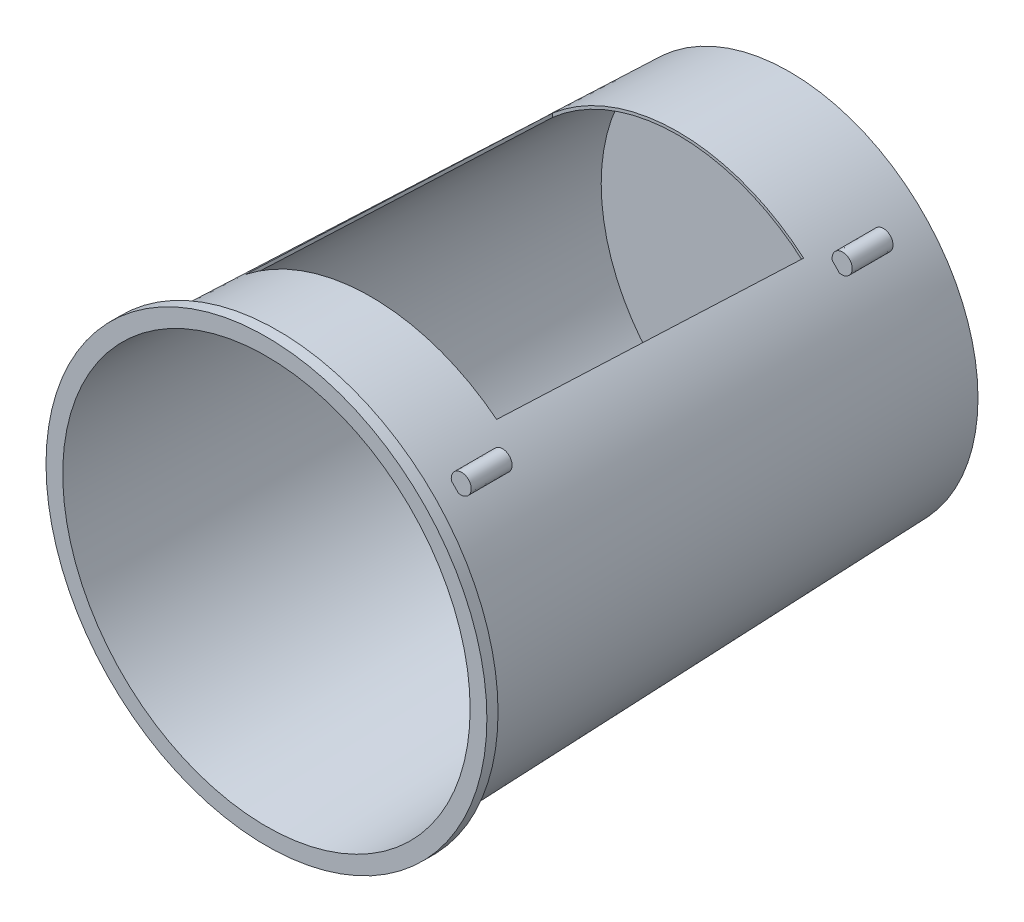
ISO-10303-21;
HEADER;
FILE_DESCRIPTION(('STEP AP214'),'2;1');
FILE_NAME('part.step','',(''),(''),'','','');
FILE_SCHEMA(('AUTOMOTIVE_DESIGN { 1 0 10303 214 1 1 1 1 }'));
ENDSEC;
DATA;
#1=APPLICATION_CONTEXT('core data for automotive mechanical design processes');
#2=APPLICATION_PROTOCOL_DEFINITION('international standard','automotive_design',2000,#1);
#3=PRODUCT_CONTEXT('',#1,'mechanical');
#4=PRODUCT('Part','Part','',(#3));
#5=PRODUCT_RELATED_PRODUCT_CATEGORY('part','',(#4));
#6=PRODUCT_DEFINITION_FORMATION('','',#4);
#7=PRODUCT_DEFINITION_CONTEXT('part definition',#1,'design');
#8=PRODUCT_DEFINITION('design','',#6,#7);
#9=PRODUCT_DEFINITION_SHAPE('','',#8);
#10=(LENGTH_UNIT() NAMED_UNIT(*) SI_UNIT(.MILLI.,.METRE.));
#11=(NAMED_UNIT(*) PLANE_ANGLE_UNIT() SI_UNIT($,.RADIAN.));
#12=(NAMED_UNIT(*) SI_UNIT($,.STERADIAN.) SOLID_ANGLE_UNIT());
#13=UNCERTAINTY_MEASURE_WITH_UNIT(LENGTH_MEASURE(1.E-05),#10,'distance_accuracy_value','');
#14=(GEOMETRIC_REPRESENTATION_CONTEXT(3) GLOBAL_UNCERTAINTY_ASSIGNED_CONTEXT((#13)) GLOBAL_UNIT_ASSIGNED_CONTEXT((#10,
#11,#12)) REPRESENTATION_CONTEXT('',''));
#15=CARTESIAN_POINT('',(0.,0.,0.));
#16=DIRECTION('',(0.,0.,1.));
#17=DIRECTION('',(1.,0.,0.));
#18=AXIS2_PLACEMENT_3D('',#15,#16,#17);
#19=CARTESIAN_POINT('',(0.,0.,-189.93070829077));
#20=DIRECTION('',(0.,0.,1.));
#21=DIRECTION('',(1.,0.,0.));
#22=AXIS2_PLACEMENT_3D('',#19,#20,#21);
#23=CONICAL_SURFACE('',#22,133.00120069566,0.0346527894684924);
#24=CARTESIAN_POINT('',(0.,0.,185.));
#25=DIRECTION('',(0.,0.,1.));
#26=DIRECTION('',(1.,0.,0.));
#27=AXIS2_PLACEMENT_3D('',#24,#25,#26);
#28=CIRCLE('',#27,145.998798585583);
#29=CARTESIAN_POINT('',(145.998798585583,0.,185.));
#30=VERTEX_POINT('',#29);
#31=EDGE_CURVE('E307',#30,#30,#28,.T.);
#32=ORIENTED_EDGE('',*,*,#31,.T.);
#33=EDGE_LOOP('',(#32));
#34=FACE_BOUND('',#33,.T.);
#35=CARTESIAN_POINT('',(0.,0.,-188.));
#36=DIRECTION('',(0.,0.,1.));
#37=DIRECTION('',(1.,0.,0.));
#38=AXIS2_PLACEMENT_3D('',#35,#36,#37);
#39=CIRCLE('',#38,133.068131916419);
#40=CARTESIAN_POINT('',(133.068131916419,0.,-188.));
#41=VERTEX_POINT('',#40);
#42=EDGE_CURVE('E301',#41,#41,#39,.T.);
#43=ORIENTED_EDGE('',*,*,#42,.F.);
#44=EDGE_LOOP('',(#43));
#45=FACE_BOUND('',#44,.T.);
#46=CARTESIAN_POINT('',(0.,0.,-110.));
#47=DIRECTION('',(0.,0.,-1.));
#48=DIRECTION('',(-1.,0.,0.));
#49=AXIS2_PLACEMENT_3D('',#46,#47,#48);
#50=CIRCLE('',#49,135.772131916941);
#51=CARTESIAN_POINT('',(-90.,101.656636798939,-110.));
#52=VERTEX_POINT('',#51);
#53=CARTESIAN_POINT('',(90.,101.656636798939,-110.));
#54=VERTEX_POINT('',#53);
#55=EDGE_CURVE('E295',#52,#54,#50,.T.);
#56=ORIENTED_EDGE('',*,*,#55,.F.);
#57=CARTESIAN_POINT('',(-90.,89.0636254051347,-374.037411749468));
#58=CARTESIAN_POINT('',(-90.,90.0676072974176,-353.665601403838));
#59=CARTESIAN_POINT('',(-90.,91.063099587906,-333.293374363985));
#60=CARTESIAN_POINT('',(-90.,93.0385628703297,-292.548170092011));
#61=CARTESIAN_POINT('',(-90.,94.0185338641786,-272.175192859983));
#62=CARTESIAN_POINT('',(-90.,96.9373487017259,-211.055324832955));
#63=CARTESIAN_POINT('',(-90.,98.8550979243955,-170.307426013567));
#64=CARTESIAN_POINT('',(-90.,102.699874120464,-87.5958899573949));
#65=CARTESIAN_POINT('',(-90.,104.62547651076,-45.6321866439225));
#66=CARTESIAN_POINT('',(-90.,108.434367562843,38.2971467555992));
#67=CARTESIAN_POINT('',(-90.,110.317656216751,80.2627768420058));
#68=CARTESIAN_POINT('',(-90.,113.115383651536,143.21250633273));
#69=CARTESIAN_POINT('',(-90.,114.043426901261,164.196002471134));
#70=CARTESIAN_POINT('',(-90.,115.891068987414,206.163366791269));
#71=CARTESIAN_POINT('',(-90.,116.810667823789,227.147234973003));
#72=CARTESIAN_POINT('',(-90.,118.6420067014,269.115304799135));
#73=CARTESIAN_POINT('',(-90.,119.553746746119,290.099506443382));
#74=CARTESIAN_POINT('',(-90.,121.369879932124,332.068227117523));
#75=CARTESIAN_POINT('',(-90.,122.274273073608,353.052746147409));
#76=CARTESIAN_POINT('',(-90.,123.175248527577,374.037411749468));
#77=B_SPLINE_CURVE_WITH_KNOTS('',3,(#57,#58,#59,#60,#61,#62,#63,#64,#65,#66,#67,#68,#69,#70,#71,
#72,#73,#74,#75,#76),.UNSPECIFIED.,.F.,.F.,(4,2,2,2,2,2,2,2,2,4),(0.,61.1896002512275,
122.379192958387,244.758163033068,370.781720741195,496.805301914434,559.817326210436,
622.829350895567,685.841347644155,748.853342683009),.UNSPECIFIED.);
#78=CARTESIAN_POINT('',(-90.,111.638772098427,110.));
#79=VERTEX_POINT('',#78);
#80=EDGE_CURVE('E245',#52,#79,#77,.T.);
#81=ORIENTED_EDGE('',*,*,#80,.T.);
#82=CARTESIAN_POINT('',(0.,0.,110.));
#83=DIRECTION('',(0.,0.,1.));
#84=DIRECTION('',(1.,0.,0.));
#85=AXIS2_PLACEMENT_3D('',#82,#83,#84);
#86=CIRCLE('',#85,143.398798585081);
#87=CARTESIAN_POINT('',(90.,111.638772098427,110.));
#88=VERTEX_POINT('',#87);
#89=EDGE_CURVE('E289',#88,#79,#86,.T.);
#90=ORIENTED_EDGE('',*,*,#89,.F.);
#91=CARTESIAN_POINT('',(90.,89.0636254051347,-374.037411749468));
#92=CARTESIAN_POINT('',(90.,90.0676072974176,-353.665601403838));
#93=CARTESIAN_POINT('',(90.,91.063099587906,-333.293374363985));
#94=CARTESIAN_POINT('',(90.,93.0385628703297,-292.548170092011));
#95=CARTESIAN_POINT('',(90.,94.0185338641786,-272.175192859983));
#96=CARTESIAN_POINT('',(90.,96.9373487017259,-211.055324832955));
#97=CARTESIAN_POINT('',(90.,98.8550979243955,-170.307426013567));
#98=CARTESIAN_POINT('',(90.,102.699874120464,-87.5958899573949));
#99=CARTESIAN_POINT('',(90.,104.62547651076,-45.6321866439225));
#100=CARTESIAN_POINT('',(90.,108.434367562843,38.2971467555992));
#101=CARTESIAN_POINT('',(90.,110.317656216751,80.2627768420058));
#102=CARTESIAN_POINT('',(90.,113.115383651536,143.21250633273));
#103=CARTESIAN_POINT('',(90.,114.043426901261,164.196002471134));
#104=CARTESIAN_POINT('',(90.,115.891068987414,206.163366791269));
#105=CARTESIAN_POINT('',(90.,116.810667823789,227.147234973003));
#106=CARTESIAN_POINT('',(90.,118.6420067014,269.115304799135));
#107=CARTESIAN_POINT('',(90.,119.553746746119,290.099506443382));
#108=CARTESIAN_POINT('',(90.,121.369879932124,332.068227117523));
#109=CARTESIAN_POINT('',(90.,122.274273073608,353.052746147409));
#110=CARTESIAN_POINT('',(90.,123.175248527577,374.037411749468));
#111=B_SPLINE_CURVE_WITH_KNOTS('',3,(#91,#92,#93,#94,#95,#96,#97,#98,#99,#100,#101,#102,#103,
#104,#105,#106,#107,#108,#109,#110),.UNSPECIFIED.,.F.,.F.,(4,2,2,2,2,2,2,2,2,4),(0.,
61.1896002512275,122.379192958387,244.758163033068,370.781720741195,496.805301914434,
559.817326210436,622.829350895567,685.841347644155,748.853342683009),.UNSPECIFIED.);
#112=EDGE_CURVE('E232',#54,#88,#111,.T.);
#113=ORIENTED_EDGE('',*,*,#112,.F.);
#114=EDGE_LOOP('',(#56,#81,#90,#113));
#115=FACE_BOUND('',#114,.T.);
#116=ADVANCED_FACE('F41',(#34,#45,#115),#23,.F.);
#117=CARTESIAN_POINT('',(0.,0.,-190.));
#118=DIRECTION('',(0.,0.,1.));
#119=DIRECTION('',(1.,0.,0.));
#120=AXIS2_PLACEMENT_3D('',#117,#118,#119);
#121=CONICAL_SURFACE('',#120,135.,0.0346527894684924);
#122=CARTESIAN_POINT('',(101.065715357302,92.877339283755,-124.789684729065));
#123=CARTESIAN_POINT('',(100.184733737483,93.8359132263013,-124.790990806455));
#124=CARTESIAN_POINT('',(99.290499636707,94.7815941603961,-124.791648497943));
#125=CARTESIAN_POINT('',(97.4755264732403,96.6471700116852,-124.791667109114));
#126=CARTESIAN_POINT('',(96.5547874105492,97.5670649288795,-124.791028028796));
#127=CARTESIAN_POINT('',(95.6207958669018,98.4740668376222,-124.789740562577));
#128=B_SPLINE_CURVE_WITH_KNOTS('',3,(#122,#123,#124,#125,#126,#127),.UNSPECIFIED.,.F.,.F.,(4,2,
4),(0.,3.90457518789542,7.80915037580249),.UNSPECIFIED.);
#129=CARTESIAN_POINT('',(100.850286553492,93.1112010640946,-124.789990673587));
#130=VERTEX_POINT('',#129);
#131=CARTESIAN_POINT('',(95.8084928532596,98.2914480446113,-124.789990673593));
#132=VERTEX_POINT('',#131);
#133=EDGE_CURVE('E173',#130,#132,#128,.T.);
#134=ORIENTED_EDGE('',*,*,#133,.T.);
#135=CARTESIAN_POINT('',(95.8854461942609,98.3657257226139,-121.706233881344));
#136=CARTESIAN_POINT('',(95.7686712306663,98.2530112187069,-126.385763032584));
#137=CARTESIAN_POINT('',(95.6518965391727,98.1402960729734,-131.065292175154));
#138=CARTESIAN_POINT('',(95.3475725358922,97.8465492071657,-143.260540474419));
#139=CARTESIAN_POINT('',(95.1600236538907,97.6655164733219,-150.776259617421));
#140=CARTESIAN_POINT('',(94.9724754737755,97.4844820838823,-158.29197873806));
#141=B_SPLINE_CURVE_WITH_KNOTS('',3,(#135,#136,#137,#138,#139,#140),.UNSPECIFIED.,.F.,.F.,(4,2,
4),(0.,14.0470283782484,36.6077427958624),.UNSPECIFIED.);
#142=CARTESIAN_POINT('',(95.0598653714643,97.568836652014,-154.789958379038));
#143=VERTEX_POINT('',#142);
#144=EDGE_CURVE('E11',#132,#143,#141,.T.);
#145=ORIENTED_EDGE('',*,*,#144,.T.);
#146=CARTESIAN_POINT('',(94.8732476883798,97.750320363789,-154.789707644403));
#147=CARTESIAN_POINT('',(95.8080979204527,96.8429120211217,-154.791006666208));
#148=CARTESIAN_POINT('',(96.7295761612279,95.9224944288822,-154.791651497327));
#149=CARTESIAN_POINT('',(98.5457886601796,94.0556407452615,-154.791632778193));
#150=CARTESIAN_POINT('',(99.4405229183563,93.1092046538804,-154.790969227939));
#151=CARTESIAN_POINT('',(100.321885185235,92.1497593129271,-154.789651486999));
#152=B_SPLINE_CURVE_WITH_KNOTS('',3,(#146,#147,#148,#149,#150,#151),.UNSPECIFIED.,.F.,.F.,(4,2,
4),(0.,3.90725222799838,7.81450445598476),.UNSPECIFIED.);
#153=CARTESIAN_POINT('',(100.107664272015,92.3824195616779,-154.789958379038));
#154=VERTEX_POINT('',#153);
#155=EDGE_CURVE('E54',#143,#154,#152,.T.);
#156=ORIENTED_EDGE('',*,*,#155,.T.);
#157=CARTESIAN_POINT('',(100.020973763606,92.2973463982562,-158.29197873806));
#158=CARTESIAN_POINT('',(100.136821732802,92.4110328199626,-153.612096160524));
#159=CARTESIAN_POINT('',(100.252669066878,92.5247195311705,-148.9322135743));
#160=CARTESIAN_POINT('',(100.554552549336,92.8209750826325,-136.736965302447));
#161=CARTESIAN_POINT('',(100.740587694943,93.0035443799733,-129.221599603099));
#162=CARTESIAN_POINT('',(100.926621202656,93.1861144239023,-121.706233881344));
#163=B_SPLINE_CURVE_WITH_KNOTS('',3,(#157,#158,#159,#160,#161,#162),.UNSPECIFIED.,.F.,.F.,(4,2,
4),(0.,14.0480894304417,36.6077427958624),.UNSPECIFIED.);
#164=EDGE_CURVE('E170',#154,#130,#163,.T.);
#165=ORIENTED_EDGE('',*,*,#164,.T.);
#166=EDGE_LOOP('',(#134,#145,#156,#165));
#167=FACE_BOUND('',#166,.T.);
#168=CARTESIAN_POINT('',(102.899803568351,105.082954785368,158.291941353487));
#169=CARTESIAN_POINT('',(102.783409639682,104.97065428562,153.628323271621));
#170=CARTESIAN_POINT('',(102.667015984789,104.858353213829,148.964705196696));
#171=CARTESIAN_POINT('',(102.362666672901,104.564703113654,136.770120450934));
#172=CARTESIAN_POINT('',(102.17471145605,104.383353165603,129.239153791257));
#173=CARTESIAN_POINT('',(101.986756953118,104.202001725841,121.708187149683));
#174=B_SPLINE_CURVE_WITH_KNOTS('',3,(#168,#169,#170,#171,#172,#173),.UNSPECIFIED.,.F.,.F.,(4,2,
4),(0.,13.9992654472103,36.6057482379346),.UNSPECIFIED.);
#175=CARTESIAN_POINT('',(102.822880774978,105.008737147525,155.209832861692));
#176=VERTEX_POINT('',#175);
#177=CARTESIAN_POINT('',(102.074150264432,104.286324652341,125.209862901135));
#178=VERTEX_POINT('',#177);
#179=EDGE_CURVE('E125',#176,#178,#174,.T.);
#180=ORIENTED_EDGE('',*,*,#179,.T.);
#181=CARTESIAN_POINT('',(101.870183038249,104.48558761549,125.210114926814));
#182=CARTESIAN_POINT('',(102.790389821351,103.588349351596,125.208934432825));
#183=CARTESIAN_POINT('',(103.698447781155,102.679291664296,125.208348652251));
#184=CARTESIAN_POINT('',(105.490266054169,100.837537442885,125.208366517931));
#185=CARTESIAN_POINT('',(106.374026367378,99.9048409087742,125.208970164186));
#186=CARTESIAN_POINT('',(107.24563785729,98.9603249512566,125.210168523855));
#187=B_SPLINE_CURVE_WITH_KNOTS('',3,(#181,#182,#183,#184,#185,#186),.UNSPECIFIED.,.F.,.F.,(4,2,
4),(0.,3.85468537277493,7.70937074554083),.UNSPECIFIED.);
#188=CARTESIAN_POINT('',(107.012664279194,99.2121935326898,125.209862901135));
#189=VERTEX_POINT('',#188);
#190=EDGE_CURVE('E127',#178,#189,#187,.T.);
#191=ORIENTED_EDGE('',*,*,#190,.T.);
#192=CARTESIAN_POINT('',(106.926005308352,99.1271160999092,121.708187149683));
#193=CARTESIAN_POINT('',(107.041428747923,99.2404328364401,126.372158647506));
#194=CARTESIAN_POINT('',(107.156851622408,99.3537498622092,131.036130152285));
#195=CARTESIAN_POINT('',(107.458638871193,99.6500333182738,143.230714875706));
#196=CARTESIAN_POINT('',(107.645002337373,99.8330002133886,150.761328105528));
#197=CARTESIAN_POINT('',(107.831364330347,100.015967862561,158.291941353487));
#198=B_SPLINE_CURVE_WITH_KNOTS('',3,(#192,#193,#194,#195,#196,#197),.UNSPECIFIED.,.F.,.F.,(4,2,
4),(0.,14.0003264415914,36.6057482379346),.UNSPECIFIED.);
#199=CARTESIAN_POINT('',(107.755090526673,99.9410834130379,155.209832861692));
#200=VERTEX_POINT('',#199);
#201=EDGE_CURVE('E112',#189,#200,#198,.T.);
#202=ORIENTED_EDGE('',*,*,#201,.T.);
#203=CARTESIAN_POINT('',(107.989371729131,99.6879049220844,155.210137680708));
#204=CARTESIAN_POINT('',(107.118189656349,100.631565071514,155.208949391695));
#205=CARTESIAN_POINT('',(106.234961910594,101.563506129267,155.208350804581));
#206=CARTESIAN_POINT('',(104.444415073141,103.403950061426,155.208333034149));
#207=CARTESIAN_POINT('',(103.537095981442,104.31245293583,155.208913850831));
#208=CARTESIAN_POINT('',(102.617731216771,105.209236718559,155.210084369411));
#209=B_SPLINE_CURVE_WITH_KNOTS('',3,(#203,#204,#205,#206,#207,#208),.UNSPECIFIED.,.F.,.F.,(4,2,
4),(0.,3.85194128962702,7.70388257926285),.UNSPECIFIED.);
#210=EDGE_CURVE('E109',#200,#176,#209,.T.);
#211=ORIENTED_EDGE('',*,*,#210,.T.);
#212=EDGE_LOOP('',(#180,#191,#202,#211));
#213=FACE_BOUND('',#212,.T.);
#214=CARTESIAN_POINT('',(0.,0.,177.));
#215=DIRECTION('',(0.,0.,1.));
#216=DIRECTION('',(1.,0.,0.));
#217=AXIS2_PLACEMENT_3D('',#214,#215,#216);
#218=CIRCLE('',#217,147.722666669123);
#219=CARTESIAN_POINT('',(147.722666669123,0.,177.));
#220=VERTEX_POINT('',#219);
#221=EDGE_CURVE('E268',#220,#220,#218,.T.);
#222=ORIENTED_EDGE('',*,*,#221,.F.);
#223=EDGE_LOOP('',(#222));
#224=FACE_BOUND('',#223,.T.);
#225=CARTESIAN_POINT('',(0.,0.,-190.));
#226=DIRECTION('',(0.,0.,1.));
#227=DIRECTION('',(1.,0.,0.));
#228=AXIS2_PLACEMENT_3D('',#225,#226,#227);
#229=CIRCLE('',#228,135.);
#230=CARTESIAN_POINT('',(135.,0.,-190.));
#231=VERTEX_POINT('',#230);
#232=EDGE_CURVE('E306',#231,#231,#229,.T.);
#233=ORIENTED_EDGE('',*,*,#232,.T.);
#234=EDGE_LOOP('',(#233));
#235=FACE_BOUND('',#234,.T.);
#236=CARTESIAN_POINT('',(-90.,91.8399681901596,-374.994513614155));
#237=CARTESIAN_POINT('',(-90.,92.8441407200379,-354.305319400002));
#238=CARTESIAN_POINT('',(-90.,93.8403230779255,-333.615738836066));
#239=CARTESIAN_POINT('',(-90.,95.8180455029985,-292.235879901309));
#240=CARTESIAN_POINT('',(-90.,96.7995855717161,-271.545601530562));
#241=CARTESIAN_POINT('',(-90.,99.7242467438915,-209.47388905803));
#242=CARTESIAN_POINT('',(-90.,101.647411887247,-168.09151409453));
#243=CARTESIAN_POINT('',(-90.,105.468323875797,-84.902998911837));
#244=CARTESIAN_POINT('',(-90.,107.365611990587,-43.0968376648368));
#245=CARTESIAN_POINT('',(-90.,111.121226418561,40.5172397240006));
#246=CARTESIAN_POINT('',(-90.,112.97955272575,82.3251558661068));
#247=CARTESIAN_POINT('',(-90.,116.662643992474,165.942597455484));
#248=CARTESIAN_POINT('',(-90.,118.487408846158,207.752122907414));
#249=CARTESIAN_POINT('',(-90.,121.202644539275,270.467350895956));
#250=CARTESIAN_POINT('',(-90.,122.10407101823,291.372579907486));
#251=CARTESIAN_POINT('',(-90.,123.900074837187,333.183331687077));
#252=CARTESIAN_POINT('',(-90.,124.794652177345,354.088854455131));
#253=CARTESIAN_POINT('',(-90.,125.686032275605,374.994513614155));
#254=B_SPLINE_CURVE_WITH_KNOTS('',3,(#236,#237,#238,#239,#240,#241,#242,#243,#244,#245,#246,
#247,#248,#249,#250,#251,#252,#253),.UNSPECIFIED.,.F.,.F.,(4,2,2,2,2,2,2,2,4),(0.,
62.1406436584152,124.281280814972,248.562364400903,374.10991834988,499.657491619445,
625.205460793101,687.979423641694,750.753385060985),.UNSPECIFIED.);
#255=CARTESIAN_POINT('',(-90.,104.314387204859,-110.));
#256=VERTEX_POINT('',#255);
#257=CARTESIAN_POINT('',(-90.,114.197898407037,110.));
#258=VERTEX_POINT('',#257);
#259=EDGE_CURVE('E116',#256,#258,#254,.T.);
#260=ORIENTED_EDGE('',*,*,#259,.F.);
#261=CARTESIAN_POINT('',(0.,0.,-110.));
#262=DIRECTION('',(0.,0.,-1.));
#263=DIRECTION('',(-1.,0.,0.));
#264=AXIS2_PLACEMENT_3D('',#261,#262,#263);
#265=CIRCLE('',#264,137.773333333869);
#266=CARTESIAN_POINT('',(90.,104.314387204859,-110.));
#267=VERTEX_POINT('',#266);
#268=EDGE_CURVE('E270',#256,#267,#265,.T.);
#269=ORIENTED_EDGE('',*,*,#268,.T.);
#270=CARTESIAN_POINT('',(90.,91.8399681901596,-374.994513614155));
#271=CARTESIAN_POINT('',(90.,92.8441407200379,-354.305319400002));
#272=CARTESIAN_POINT('',(90.,93.8403230779255,-333.615738836066));
#273=CARTESIAN_POINT('',(90.,95.8180455029985,-292.235879901309));
#274=CARTESIAN_POINT('',(90.,96.7995855717161,-271.545601530562));
#275=CARTESIAN_POINT('',(90.,99.7242467438915,-209.47388905803));
#276=CARTESIAN_POINT('',(90.,101.647411887247,-168.09151409453));
#277=CARTESIAN_POINT('',(90.,105.468323875797,-84.9029989118369));
#278=CARTESIAN_POINT('',(90.,107.365611990587,-43.0968376648368));
#279=CARTESIAN_POINT('',(90.,111.121226418561,40.5172397240006));
#280=CARTESIAN_POINT('',(90.,112.97955272575,82.3251558661068));
#281=CARTESIAN_POINT('',(90.,116.662643992474,165.942597455484));
#282=CARTESIAN_POINT('',(90.,118.487408846158,207.752122907414));
#283=CARTESIAN_POINT('',(90.,121.202644539275,270.467350895956));
#284=CARTESIAN_POINT('',(90.,122.10407101823,291.372579907486));
#285=CARTESIAN_POINT('',(90.,123.900074837187,333.183331687077));
#286=CARTESIAN_POINT('',(90.,124.794652177345,354.088854455131));
#287=CARTESIAN_POINT('',(90.,125.686032275605,374.994513614155));
#288=B_SPLINE_CURVE_WITH_KNOTS('',3,(#270,#271,#272,#273,#274,#275,#276,#277,#278,#279,#280,
#281,#282,#283,#284,#285,#286,#287),.UNSPECIFIED.,.F.,.F.,(4,2,2,2,2,2,2,2,4),(0.,
62.1406436584152,124.281280814972,248.562364400903,374.10991834988,499.657491619445,
625.205460793101,687.979423641694,750.753385060985),.UNSPECIFIED.);
#289=CARTESIAN_POINT('',(90.,114.197898407037,110.));
#290=VERTEX_POINT('',#289);
#291=EDGE_CURVE('E260',#267,#290,#288,.T.);
#292=ORIENTED_EDGE('',*,*,#291,.T.);
#293=CARTESIAN_POINT('',(0.,0.,110.));
#294=DIRECTION('',(0.,0.,1.));
#295=DIRECTION('',(1.,0.,0.));
#296=AXIS2_PLACEMENT_3D('',#293,#294,#295);
#297=CIRCLE('',#296,145.400000002008);
#298=EDGE_CURVE('E275',#290,#258,#297,.T.);
#299=ORIENTED_EDGE('',*,*,#298,.T.);
#300=EDGE_LOOP('',(#260,#269,#292,#299));
#301=FACE_BOUND('',#300,.T.);
#302=ADVANCED_FACE('F43',(#167,#213,#224,#235,#301),#121,.T.);
#303=CARTESIAN_POINT('',(0.,0.,185.));
#304=DIRECTION('',(0.,0.,1.));
#305=DIRECTION('',(1.,0.,0.));
#306=AXIS2_PLACEMENT_3D('',#303,#304,#305);
#307=PLANE('',#306);
#308=ORIENTED_EDGE('',*,*,#31,.F.);
#309=EDGE_LOOP('',(#308));
#310=FACE_BOUND('',#309,.T.);
#311=CARTESIAN_POINT('',(0.,0.,185.));
#312=DIRECTION('',(0.,0.,1.));
#313=DIRECTION('',(1.,0.,0.));
#314=AXIS2_PLACEMENT_3D('',#311,#312,#313);
#315=CIRCLE('',#314,158.);
#316=CARTESIAN_POINT('',(158.,0.,185.));
#317=VERTEX_POINT('',#316);
#318=EDGE_CURVE('E299',#317,#317,#315,.T.);
#319=ORIENTED_EDGE('',*,*,#318,.T.);
#320=EDGE_LOOP('',(#319));
#321=FACE_BOUND('',#320,.T.);
#322=ADVANCED_FACE('F319',(#310,#321),#307,.T.);
#323=CARTESIAN_POINT('',(0.,0.,-188.));
#324=DIRECTION('',(0.,0.,1.));
#325=DIRECTION('',(1.,0.,0.));
#326=AXIS2_PLACEMENT_3D('',#323,#324,#325);
#327=PLANE('',#326);
#328=ORIENTED_EDGE('',*,*,#42,.T.);
#329=EDGE_LOOP('',(#328));
#330=FACE_BOUND('',#329,.T.);
#331=ADVANCED_FACE('F322',(#330),#327,.T.);
#332=CARTESIAN_POINT('',(0.,0.,177.));
#333=DIRECTION('',(0.,0.,1.));
#334=DIRECTION('',(1.,0.,0.));
#335=AXIS2_PLACEMENT_3D('',#332,#333,#334);
#336=PLANE('',#335);
#337=ORIENTED_EDGE('',*,*,#221,.T.);
#338=EDGE_LOOP('',(#337));
#339=FACE_BOUND('',#338,.T.);
#340=CARTESIAN_POINT('',(0.,0.,177.));
#341=DIRECTION('',(0.,0.,1.));
#342=DIRECTION('',(1.,0.,0.));
#343=AXIS2_PLACEMENT_3D('',#340,#341,#342);
#344=CIRCLE('',#343,158.);
#345=CARTESIAN_POINT('',(158.,0.,177.));
#346=VERTEX_POINT('',#345);
#347=EDGE_CURVE('E293',#346,#346,#344,.T.);
#348=ORIENTED_EDGE('',*,*,#347,.F.);
#349=EDGE_LOOP('',(#348));
#350=FACE_BOUND('',#349,.T.);
#351=ADVANCED_FACE('F313',(#339,#350),#336,.F.);
#352=CARTESIAN_POINT('',(0.,0.,185.));
#353=DIRECTION('',(0.,0.,-1.));
#354=DIRECTION('',(-1.,0.,0.));
#355=AXIS2_PLACEMENT_3D('',#352,#353,#354);
#356=CYLINDRICAL_SURFACE('',#355,158.);
#357=ORIENTED_EDGE('',*,*,#318,.F.);
#358=EDGE_LOOP('',(#357));
#359=FACE_BOUND('',#358,.T.);
#360=ORIENTED_EDGE('',*,*,#347,.T.);
#361=EDGE_LOOP('',(#360));
#362=FACE_BOUND('',#361,.T.);
#363=ADVANCED_FACE('F337',(#359,#362),#356,.T.);
#364=CARTESIAN_POINT('',(0.,0.,-190.));
#365=DIRECTION('',(0.,0.,1.));
#366=DIRECTION('',(1.,0.,0.));
#367=AXIS2_PLACEMENT_3D('',#364,#365,#366);
#368=PLANE('',#367);
#369=ORIENTED_EDGE('',*,*,#232,.F.);
#370=EDGE_LOOP('',(#369));
#371=FACE_BOUND('',#370,.T.);
#372=ADVANCED_FACE('F345',(#371),#368,.F.);
#373=CARTESIAN_POINT('',(-90.,250.,110.));
#374=DIRECTION('',(0.,0.,1.));
#375=DIRECTION('',(1.,0.,0.));
#376=AXIS2_PLACEMENT_3D('',#373,#374,#375);
#377=PLANE('',#376);
#378=ORIENTED_EDGE('',*,*,#89,.T.);
#379=DIRECTION('',(0.,-1.,0.));
#380=VECTOR('',#379,1.);
#381=CARTESIAN_POINT('',(-90.,250.,110.));
#382=LINE('',#381,#380);
#383=EDGE_CURVE('E223',#258,#79,#382,.T.);
#384=ORIENTED_EDGE('',*,*,#383,.F.);
#385=ORIENTED_EDGE('',*,*,#298,.F.);
#386=DIRECTION('',(0.,-1.,0.));
#387=VECTOR('',#386,1.);
#388=CARTESIAN_POINT('',(90.,250.,110.));
#389=LINE('',#388,#387);
#390=EDGE_CURVE('E220',#290,#88,#389,.T.);
#391=ORIENTED_EDGE('',*,*,#390,.T.);
#392=EDGE_LOOP('',(#378,#384,#385,#391));
#393=FACE_BOUND('',#392,.T.);
#394=ADVANCED_FACE('F287',(#393),#377,.F.);
#395=CARTESIAN_POINT('',(-90.,0.,-110.));
#396=DIRECTION('',(0.,0.,-1.));
#397=DIRECTION('',(-1.,0.,0.));
#398=AXIS2_PLACEMENT_3D('',#395,#396,#397);
#399=PLANE('',#398);
#400=ORIENTED_EDGE('',*,*,#55,.T.);
#401=DIRECTION('',(0.,1.,0.));
#402=VECTOR('',#401,1.);
#403=CARTESIAN_POINT('',(90.,0.,-110.));
#404=LINE('',#403,#402);
#405=EDGE_CURVE('E230',#54,#267,#404,.T.);
#406=ORIENTED_EDGE('',*,*,#405,.T.);
#407=ORIENTED_EDGE('',*,*,#268,.F.);
#408=DIRECTION('',(0.,1.,0.));
#409=VECTOR('',#408,1.);
#410=CARTESIAN_POINT('',(-90.,0.,-110.));
#411=LINE('',#410,#409);
#412=EDGE_CURVE('E226',#52,#256,#411,.T.);
#413=ORIENTED_EDGE('',*,*,#412,.F.);
#414=EDGE_LOOP('',(#400,#406,#407,#413));
#415=FACE_BOUND('',#414,.T.);
#416=ADVANCED_FACE('F252',(#415),#399,.F.);
#417=CARTESIAN_POINT('',(-90.,0.,0.));
#418=DIRECTION('',(1.,0.,0.));
#419=DIRECTION('',(0.,0.,-1.));
#420=AXIS2_PLACEMENT_3D('',#417,#418,#419);
#421=PLANE('',#420);
#422=ORIENTED_EDGE('',*,*,#412,.T.);
#423=ORIENTED_EDGE('',*,*,#259,.T.);
#424=ORIENTED_EDGE('',*,*,#383,.T.);
#425=ORIENTED_EDGE('',*,*,#80,.F.);
#426=EDGE_LOOP('',(#422,#423,#424,#425));
#427=FACE_BOUND('',#426,.T.);
#428=ADVANCED_FACE('F159',(#427),#421,.T.);
#429=CARTESIAN_POINT('',(90.,0.,0.));
#430=DIRECTION('',(1.,0.,0.));
#431=DIRECTION('',(0.,0.,-1.));
#432=AXIS2_PLACEMENT_3D('',#429,#430,#431);
#433=PLANE('',#432);
#434=ORIENTED_EDGE('',*,*,#112,.T.);
#435=ORIENTED_EDGE('',*,*,#390,.F.);
#436=ORIENTED_EDGE('',*,*,#291,.F.);
#437=ORIENTED_EDGE('',*,*,#405,.F.);
#438=EDGE_LOOP('',(#434,#435,#436,#437));
#439=FACE_BOUND('',#438,.T.);
#440=ADVANCED_FACE('F160',(#439),#433,.F.);
#441=CARTESIAN_POINT('',(108.8684259132,105.958682276689,125.000022663646));
#442=DIRECTION('',(0.0248888382133139,0.0242236302983112,0.999396698747581));
#443=DIRECTION('',(0.999690042979803,0.,-0.0248961436178102));
#444=AXIS2_PLACEMENT_3D('',#441,#442,#443);
#445=CONICAL_SURFACE('',#444,0.000652549088563702,1.57078183440199);
#446=CARTESIAN_POINT('',(108.8684259132,105.958682276689,125.000022663646));
#447=DIRECTION('',(-0.0248888382133139,-0.0242236302983112,-0.999396698747581));
#448=DIRECTION('',(-0.999690042979803,0.,0.0248961436178102));
#449=AXIS2_PLACEMENT_3D('',#446,#447,#448);
#450=CIRCLE('',#449,0.000652549088562976);
#451=CARTESIAN_POINT('',(108.867773566374,105.958682276689,125.000038909602));
#452=VERTEX_POINT('',#451);
#453=EDGE_CURVE('E219',#452,#452,#450,.T.);
#454=ORIENTED_EDGE('',*,*,#453,.F.);
#455=EDGE_LOOP('',(#454));
#456=FACE_BOUND('',#455,.T.);
#457=ORIENTED_EDGE('',*,*,#190,.F.);
#458=CARTESIAN_POINT('',(108.868428437934,105.958684733943,125.000124042841));
#459=DIRECTION('',(-0.0248888382133139,-0.0242236302983112,-0.999396698747581));
#460=DIRECTION('',(-0.999690042979803,0.,0.0248961436178102));
#461=AXIS2_PLACEMENT_3D('',#458,#459,#460);
#462=CIRCLE('',#461,7.0002138917418);
#463=EDGE_CURVE('E123',#178,#189,#462,.T.);
#464=ORIENTED_EDGE('',*,*,#463,.T.);
#465=EDGE_LOOP('',(#457,#464));
#466=FACE_BOUND('',#465,.T.);
#467=ADVANCED_FACE('F150',(#456,#466),#445,.T.);
#468=CARTESIAN_POINT('',(108.868428437934,105.958684733943,125.000124042841));
#469=DIRECTION('',(-0.0248888382133139,-0.0242236302983112,-0.999396698747581));
#470=DIRECTION('',(-0.999690042979803,0.,0.0248961436178102));
#471=AXIS2_PLACEMENT_3D('',#468,#469,#470);
#472=CONICAL_SURFACE('',#471,7.0002138917418,1.44923929048377E-05);
#473=ORIENTED_EDGE('',*,*,#179,.F.);
#474=CARTESIAN_POINT('',(109.615541718489,106.685829799696,155.000019569427));
#475=DIRECTION('',(-0.0248888382133139,-0.0242236302983112,-0.999396698747581));
#476=DIRECTION('',(-0.999690042979803,0.,0.0248961436178102));
#477=AXIS2_PLACEMENT_3D('',#474,#475,#476);
#478=CIRCLE('',#477,6.99977885901291);
#479=EDGE_CURVE('E66',#176,#200,#478,.T.);
#480=ORIENTED_EDGE('',*,*,#479,.T.);
#481=ORIENTED_EDGE('',*,*,#201,.F.);
#482=ORIENTED_EDGE('',*,*,#463,.F.);
#483=EDGE_LOOP('',(#473,#480,#481,#482));
#484=FACE_BOUND('',#483,.T.);
#485=ADVANCED_FACE('F117',(#484),#472,.T.);
#486=CARTESIAN_POINT('',(109.615541718489,106.685829799696,155.000019569427));
#487=DIRECTION('',(0.0248888382133139,0.0242236302983112,0.999396698747581));
#488=DIRECTION('',(0.999690042979803,0.,-0.0248961436178102));
#489=AXIS2_PLACEMENT_3D('',#486,#487,#488);
#490=CONICAL_SURFACE('',#489,6.99977885901291,1.57078183440199);
#491=CARTESIAN_POINT('',(109.615539193756,106.685827342442,154.999918190233));
#492=DIRECTION('',(-0.0248888382133139,-0.0242236302983112,-0.999396698747581));
#493=DIRECTION('',(-0.999690042979803,0.,0.0248961436178102));
#494=AXIS2_PLACEMENT_3D('',#491,#492,#493);
#495=CIRCLE('',#494,0.000217516359639825);
#496=CARTESIAN_POINT('',(109.615321744817,106.685827342442,154.999923605552));
#497=VERTEX_POINT('',#496);
#498=EDGE_CURVE('E122',#497,#497,#495,.T.);
#499=ORIENTED_EDGE('',*,*,#498,.T.);
#500=EDGE_LOOP('',(#499));
#501=FACE_BOUND('',#500,.T.);
#502=ORIENTED_EDGE('',*,*,#210,.F.);
#503=ORIENTED_EDGE('',*,*,#479,.F.);
#504=EDGE_LOOP('',(#502,#503));
#505=FACE_BOUND('',#504,.T.);
#506=ADVANCED_FACE('F113',(#501,#505),#490,.F.);
#507=CARTESIAN_POINT('',(109.615539193756,106.685827342442,154.999918190233));
#508=DIRECTION('',(-0.0248888382133139,-0.0242236302983112,-0.999396698747581));
#509=DIRECTION('',(-0.999690042979803,0.,0.0248961436178102));
#510=AXIS2_PLACEMENT_3D('',#507,#508,#509);
#511=CONICAL_SURFACE('',#510,0.000217516359638558,1.44923929058085E-05);
#512=CARTESIAN_POINT('',(108.867773566374,105.958682276689,125.000038909602));
#513=CARTESIAN_POINT('',(108.875560526566,105.966256704457,125.312537708518));
#514=CARTESIAN_POINT('',(108.883347486758,105.973831132225,125.625036507435));
#515=CARTESIAN_POINT('',(108.898921407142,105.988979987762,126.250034105267));
#516=CARTESIAN_POINT('',(108.906708367334,105.99655441553,126.562532904183));
#517=CARTESIAN_POINT('',(108.922282287719,106.011703271067,127.187530502015));
#518=CARTESIAN_POINT('',(108.930069247911,106.019277698835,127.500029300931));
#519=CARTESIAN_POINT('',(108.945643168295,106.034426554371,128.125026898764));
#520=CARTESIAN_POINT('',(108.953430128487,106.04200098214,128.43752569768));
#521=CARTESIAN_POINT('',(108.969004048871,106.057149837676,129.062523295512));
#522=CARTESIAN_POINT('',(108.976791009063,106.064724265444,129.375022094428));
#523=CARTESIAN_POINT('',(108.992364929448,106.079873120981,130.000019692261));
#524=CARTESIAN_POINT('',(109.00015188964,106.087447548749,130.312518491177));
#525=CARTESIAN_POINT('',(109.015725810024,106.102596404286,130.937516089009));
#526=CARTESIAN_POINT('',(109.023512770216,106.110170832054,131.250014887925));
#527=CARTESIAN_POINT('',(109.0390866906,106.125319687591,131.875012485757));
#528=CARTESIAN_POINT('',(109.046873650792,106.132894115359,132.187511284674));
#529=CARTESIAN_POINT('',(109.062447571177,106.148042970895,132.812508882506));
#530=CARTESIAN_POINT('',(109.070234531369,106.155617398664,133.125007681422));
#531=CARTESIAN_POINT('',(109.085808451753,106.1707662542,133.750005279254));
#532=CARTESIAN_POINT('',(109.093595411945,106.178340681968,134.06250407817));
#533=CARTESIAN_POINT('',(109.109169332329,106.193489537505,134.687501676003));
#534=CARTESIAN_POINT('',(109.116956292521,106.201063965273,135.000000474919));
#535=CARTESIAN_POINT('',(109.132530212906,106.21621282081,135.624998072751));
#536=CARTESIAN_POINT('',(109.140317173098,106.223787248578,135.937496871667));
#537=CARTESIAN_POINT('',(109.155891093482,106.238936104114,136.562494469499));
#538=CARTESIAN_POINT('',(109.163678053674,106.246510531883,136.874993268416));
#539=CARTESIAN_POINT('',(109.179251974058,106.261659387419,137.499990866248));
#540=CARTESIAN_POINT('',(109.18703893425,106.269233815187,137.812489665164));
#541=CARTESIAN_POINT('',(109.202612854635,106.284382670724,138.437487262996));
#542=CARTESIAN_POINT('',(109.210399814827,106.291957098492,138.749986061912));
#543=CARTESIAN_POINT('',(109.225973735211,106.307105954029,139.374983659745));
#544=CARTESIAN_POINT('',(109.233760695403,106.314680381797,139.687482458661));
#545=CARTESIAN_POINT('',(109.249334615787,106.329829237334,140.312480056493));
#546=CARTESIAN_POINT('',(109.25712157598,106.337403665102,140.624978855409));
#547=CARTESIAN_POINT('',(109.272695496364,106.352552520638,141.249976453242));
#548=CARTESIAN_POINT('',(109.280482456556,106.360126948407,141.562475252158));
#549=CARTESIAN_POINT('',(109.29605637694,106.375275803943,142.18747284999));
#550=CARTESIAN_POINT('',(109.303843337132,106.382850231711,142.499971648906));
#551=CARTESIAN_POINT('',(109.319417257516,106.397999087248,143.124969246738));
#552=CARTESIAN_POINT('',(109.327204217709,106.405573515016,143.437468045655));
#553=CARTESIAN_POINT('',(109.342778138093,106.420722370553,144.062465643487));
#554=CARTESIAN_POINT('',(109.350565098285,106.428296798321,144.374964442403));
#555=CARTESIAN_POINT('',(109.366139018669,106.443445653857,144.999962040235));
#556=CARTESIAN_POINT('',(109.373925978861,106.451020081626,145.312460839151));
#557=CARTESIAN_POINT('',(109.389499899245,106.466168937162,145.937458436984));
#558=CARTESIAN_POINT('',(109.397286859438,106.47374336493,146.2499572359));
#559=CARTESIAN_POINT('',(109.412860779822,106.488892220467,146.874954833732));
#560=CARTESIAN_POINT('',(109.420647740014,106.496466648235,147.187453632648));
#561=CARTESIAN_POINT('',(109.436221660398,106.511615503772,147.81245123048));
#562=CARTESIAN_POINT('',(109.44400862059,106.51918993154,148.124950029397));
#563=CARTESIAN_POINT('',(109.459582540974,106.534338787077,148.749947627229));
#564=CARTESIAN_POINT('',(109.467369501167,106.541913214845,149.062446426145));
#565=CARTESIAN_POINT('',(109.482943421551,106.557062070381,149.687444023977));
#566=CARTESIAN_POINT('',(109.490730381743,106.56463649815,149.999942822893));
#567=CARTESIAN_POINT('',(109.506304302127,106.579785353686,150.624940420726));
#568=CARTESIAN_POINT('',(109.514091262319,106.587359781454,150.937439219642));
#569=CARTESIAN_POINT('',(109.529665182703,106.602508636991,151.562436817474));
#570=CARTESIAN_POINT('',(109.537452142896,106.610083064759,151.87493561639));
#571=CARTESIAN_POINT('',(109.55302606328,106.625231920296,152.499933214223));
#572=CARTESIAN_POINT('',(109.560813023472,106.632806348064,152.812432013139));
#573=CARTESIAN_POINT('',(109.576386943856,106.6479552036,153.437429610971));
#574=CARTESIAN_POINT('',(109.584173904048,106.655529631369,153.749928409887));
#575=CARTESIAN_POINT('',(109.599747824433,106.670678486905,154.374926007719));
#576=CARTESIAN_POINT('',(109.607534784625,106.678252914673,154.687424806636));
#577=CARTESIAN_POINT('',(109.615321744817,106.685827342442,154.999923605552));
#578=B_SPLINE_CURVE_WITH_KNOTS('',3,(#512,#513,#514,#515,#516,#517,#518,#519,#520,#521,#522,
#523,#524,#525,#526,#527,#528,#529,#530,#531,#532,#533,#534,#535,#536,#537,#538,#539,#540,#541,
#542,#543,#544,#545,#546,#547,#548,#549,#550,#551,#552,#553,#554,#555,#556,#557,#558,#559,#560,
#561,#562,#563,#564,#565,#566,#567,#568,#569,#570,#571,#572,#573,#574,#575,#576,#577),
.UNSPECIFIED.,.F.,.F.,(4,2,2,2,2,2,2,2,2,2,2,2,2,2,2,2,2,2,2,2,2,2,2,2,2,2,2,2,2,2,2,2,4),(0.,
0.938062669687731,1.87612533937549,2.81418800906325,3.75225067875101,4.69031334843877,
5.62837601812652,6.56643868781426,7.50450135750204,8.44256402718977,9.38062669687756,
10.3186893665653,11.2567520362531,12.1948147059408,13.1328773756286,14.0709400453163,
15.0090027150041,15.9470653846918,16.8851280543796,17.8231907240673,18.7612533937551,
19.6993160634429,20.6373787331306,21.5754414028184,22.5135040725061,23.4515667421939,
24.3896294118816,25.3276920815694,26.2657547512571,27.2038174209449,28.1418800906327,
29.0799427603204,30.0180054300082),.UNSPECIFIED.);
#579=EDGE_CURVE('BSEAM196',#452,#497,#578,.T.);
#580=ORIENTED_EDGE('',*,*,#453,.T.);
#581=ORIENTED_EDGE('',*,*,#498,.F.);
#582=ORIENTED_EDGE('',*,*,#579,.T.);
#583=ORIENTED_EDGE('',*,*,#579,.F.);
#584=EDGE_LOOP('',(#580,#582,#581,#583));
#585=FACE_BOUND('',#584,.T.);
#586=ADVANCED_FACE('F196',(#585),#511,.F.);
#587=CARTESIAN_POINT('',(101.895365000857,99.1719914661126,-154.99914789764));
#588=DIRECTION('',(0.0248888382133139,0.0242236302983112,0.999396698747581));
#589=DIRECTION('',(0.999690042979803,0.,-0.0248961436178102));
#590=AXIS2_PLACEMENT_3D('',#587,#588,#589);
#591=CONICAL_SURFACE('',#590,0.0245343846126482,1.57078183440199);
#592=CARTESIAN_POINT('',(101.895365000857,99.1719914661126,-154.99914789764));
#593=DIRECTION('',(-0.0248888382133139,-0.0242236302983112,-0.999396698747581));
#594=DIRECTION('',(-0.999690042979803,0.,0.0248961436178102));
#595=AXIS2_PLACEMENT_3D('',#592,#593,#594);
#596=CIRCLE('',#595,0.0245343846126485);
#597=CARTESIAN_POINT('',(101.870838220849,99.1719914661126,-154.998537086077));
#598=VERTEX_POINT('',#597);
#599=EDGE_CURVE('E208',#598,#598,#596,.T.);
#600=ORIENTED_EDGE('',*,*,#599,.F.);
#601=EDGE_LOOP('',(#600));
#602=FACE_BOUND('',#601,.T.);
#603=ORIENTED_EDGE('',*,*,#155,.F.);
#604=CARTESIAN_POINT('',(101.89536752559,99.1719939233672,-154.999046518446));
#605=DIRECTION('',(-0.0248888382133139,-0.0242236302983112,-0.999396698747581));
#606=DIRECTION('',(-0.999690042979803,0.,0.0248961436178102));
#607=AXIS2_PLACEMENT_3D('',#604,#605,#606);
#608=CIRCLE('',#607,7.02409572726588);
#609=EDGE_CURVE('E210',#143,#154,#608,.T.);
#610=ORIENTED_EDGE('',*,*,#609,.T.);
#611=EDGE_LOOP('',(#603,#610));
#612=FACE_BOUND('',#611,.T.);
#613=ADVANCED_FACE('F189',(#602,#612),#591,.T.);
#614=CARTESIAN_POINT('',(102.642480806146,99.8991389891201,-124.99915099186));
#615=DIRECTION('',(0.0248888382133139,0.0242236302983112,0.999396698747581));
#616=DIRECTION('',(0.999690042979803,0.,-0.0248961436178102));
#617=AXIS2_PLACEMENT_3D('',#614,#615,#616);
#618=CONICAL_SURFACE('',#617,7.02366069453698,1.57078183440199);
#619=CARTESIAN_POINT('',(102.642478281412,99.8991365318655,-124.999252371054));
#620=DIRECTION('',(-0.0248888382133139,-0.0242236302983112,-0.999396698747581));
#621=DIRECTION('',(-0.999690042979803,0.,0.0248961436178102));
#622=AXIS2_PLACEMENT_3D('',#619,#620,#621);
#623=CIRCLE('',#622,0.0240993518837368);
#624=CARTESIAN_POINT('',(102.618386399292,99.8991365318655,-124.998652390128));
#625=VERTEX_POINT('',#624);
#626=EDGE_CURVE('E207',#625,#625,#623,.T.);
#627=ORIENTED_EDGE('',*,*,#626,.T.);
#628=EDGE_LOOP('',(#627));
#629=FACE_BOUND('',#628,.T.);
#630=ORIENTED_EDGE('',*,*,#133,.F.);
#631=CARTESIAN_POINT('',(102.642480806146,99.8991389891201,-124.99915099186));
#632=DIRECTION('',(-0.0248888382133139,-0.0242236302983112,-0.999396698747581));
#633=DIRECTION('',(-0.999690042979803,0.,0.0248961436178102));
#634=AXIS2_PLACEMENT_3D('',#631,#632,#633);
#635=CIRCLE('',#634,7.02366069453699);
#636=EDGE_CURVE('E65',#132,#130,#635,.T.);
#637=ORIENTED_EDGE('',*,*,#636,.F.);
#638=EDGE_LOOP('',(#630,#637));
#639=FACE_BOUND('',#638,.T.);
#640=ADVANCED_FACE('F185',(#629,#639),#618,.F.);
#641=CARTESIAN_POINT('',(101.89536752559,99.1719939233672,-154.999046518446));
#642=DIRECTION('',(-0.0248888382133139,-0.0242236302983112,-0.999396698747581));
#643=DIRECTION('',(-0.999690042979803,0.,0.0248961436178102));
#644=AXIS2_PLACEMENT_3D('',#641,#642,#643);
#645=CONICAL_SURFACE('',#644,7.02409572726588,1.44923929048377E-05);
#646=ORIENTED_EDGE('',*,*,#144,.F.);
#647=ORIENTED_EDGE('',*,*,#636,.T.);
#648=ORIENTED_EDGE('',*,*,#164,.F.);
#649=ORIENTED_EDGE('',*,*,#609,.F.);
#650=EDGE_LOOP('',(#646,#647,#648,#649));
#651=FACE_BOUND('',#650,.T.);
#652=ADVANCED_FACE('F177',(#651),#645,.T.);
#653=CARTESIAN_POINT('',(102.642478281412,99.8991365318655,-124.999252371054));
#654=DIRECTION('',(-0.0248888382133139,-0.0242236302983112,-0.999396698747581));
#655=DIRECTION('',(-0.999690042979803,0.,0.0248961436178102));
#656=AXIS2_PLACEMENT_3D('',#653,#654,#655);
#657=CONICAL_SURFACE('',#656,0.0240993518837334,1.44923929054614E-05);
#658=ORIENTED_EDGE('',*,*,#599,.T.);
#659=EDGE_LOOP('',(#658));
#660=FACE_BOUND('',#659,.T.);
#661=ORIENTED_EDGE('',*,*,#626,.F.);
#662=EDGE_LOOP('',(#661));
#663=FACE_BOUND('',#662,.T.);
#664=ADVANCED_FACE('F181',(#660,#663),#657,.F.);
#665=CLOSED_SHELL('',(#116,#302,#322,#331,#351,#363,#372,#394,#416,#428,#440,#467,#485,#506,
#586,#613,#640,#652,#664));
#666=MANIFOLD_SOLID_BREP('B2',#665);
#667=ADVANCED_BREP_SHAPE_REPRESENTATION('',(#18,#666),#14);
#668=SHAPE_DEFINITION_REPRESENTATION(#9,#667);
ENDSEC;
END-ISO-10303-21;
